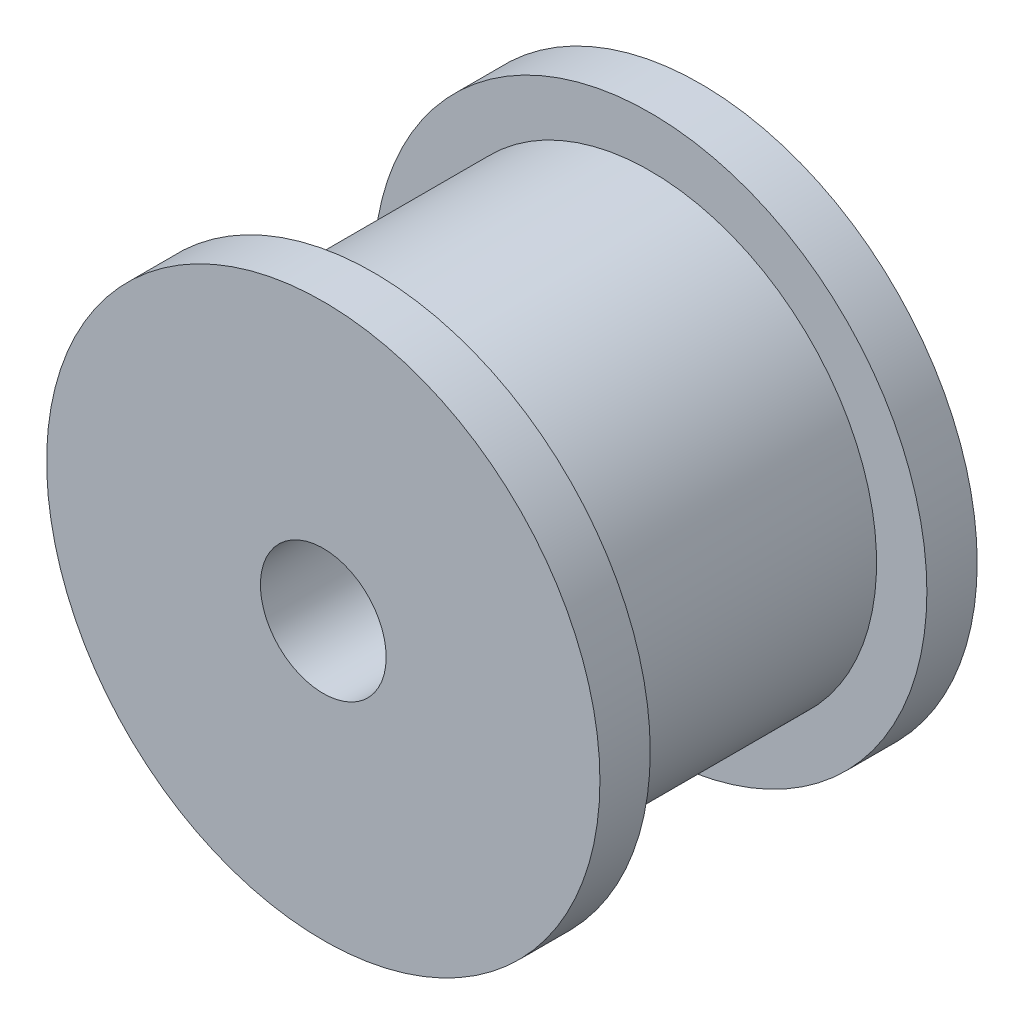
ISO-10303-21;
HEADER;
FILE_DESCRIPTION(('STEP AP214'),'2;1');
FILE_NAME('part.step','',(''),(''),'','','');
FILE_SCHEMA(('AUTOMOTIVE_DESIGN { 1 0 10303 214 1 1 1 1 }'));
ENDSEC;
DATA;
#1=APPLICATION_CONTEXT('core data for automotive mechanical design processes');
#2=APPLICATION_PROTOCOL_DEFINITION('international standard','automotive_design',2000,#1);
#3=PRODUCT_CONTEXT('',#1,'mechanical');
#4=PRODUCT('Part','Part','',(#3));
#5=PRODUCT_RELATED_PRODUCT_CATEGORY('part','',(#4));
#6=PRODUCT_DEFINITION_FORMATION('','',#4);
#7=PRODUCT_DEFINITION_CONTEXT('part definition',#1,'design');
#8=PRODUCT_DEFINITION('design','',#6,#7);
#9=PRODUCT_DEFINITION_SHAPE('','',#8);
#10=(LENGTH_UNIT() NAMED_UNIT(*) SI_UNIT(.MILLI.,.METRE.));
#11=(NAMED_UNIT(*) PLANE_ANGLE_UNIT() SI_UNIT($,.RADIAN.));
#12=(NAMED_UNIT(*) SI_UNIT($,.STERADIAN.) SOLID_ANGLE_UNIT());
#13=UNCERTAINTY_MEASURE_WITH_UNIT(LENGTH_MEASURE(1.E-05),#10,'distance_accuracy_value','');
#14=(GEOMETRIC_REPRESENTATION_CONTEXT(3) GLOBAL_UNCERTAINTY_ASSIGNED_CONTEXT((#13)) GLOBAL_UNIT_ASSIGNED_CONTEXT((#10,
#11,#12)) REPRESENTATION_CONTEXT('',''));
#15=CARTESIAN_POINT('',(0.,0.,0.));
#16=DIRECTION('',(0.,0.,1.));
#17=DIRECTION('',(1.,0.,0.));
#18=AXIS2_PLACEMENT_3D('',#15,#16,#17);
#19=CARTESIAN_POINT('',(0.,0.,15.));
#20=DIRECTION('',(0.,0.,-1.));
#21=DIRECTION('',(-1.,0.,0.));
#22=AXIS2_PLACEMENT_3D('',#19,#20,#21);
#23=CYLINDRICAL_SURFACE('',#22,9.);
#24=CARTESIAN_POINT('',(0.,0.,13.));
#25=DIRECTION('',(0.,0.,1.));
#26=DIRECTION('',(1.,0.,0.));
#27=AXIS2_PLACEMENT_3D('',#24,#25,#26);
#28=CIRCLE('',#27,9.);
#29=CARTESIAN_POINT('',(9.,0.,13.));
#30=VERTEX_POINT('',#29);
#31=EDGE_CURVE('E47',#30,#30,#28,.T.);
#32=ORIENTED_EDGE('',*,*,#31,.F.);
#33=EDGE_LOOP('',(#32));
#34=FACE_BOUND('',#33,.T.);
#35=CARTESIAN_POINT('',(0.,0.,2.));
#36=DIRECTION('',(0.,0.,-1.));
#37=DIRECTION('',(-1.,0.,0.));
#38=AXIS2_PLACEMENT_3D('',#35,#36,#37);
#39=CIRCLE('',#38,9.);
#40=CARTESIAN_POINT('',(-9.,0.,2.));
#41=VERTEX_POINT('',#40);
#42=EDGE_CURVE('E10',#41,#41,#39,.T.);
#43=ORIENTED_EDGE('',*,*,#42,.F.);
#44=EDGE_LOOP('',(#43));
#45=FACE_BOUND('',#44,.T.);
#46=ADVANCED_FACE('F41',(#34,#45),#23,.T.);
#47=CARTESIAN_POINT('',(0.,0.,13.));
#48=DIRECTION('',(0.,0.,1.));
#49=DIRECTION('',(1.,0.,0.));
#50=AXIS2_PLACEMENT_3D('',#47,#48,#49);
#51=CYLINDRICAL_SURFACE('',#50,11.);
#52=CARTESIAN_POINT('',(0.,0.,13.));
#53=DIRECTION('',(0.,0.,1.));
#54=DIRECTION('',(1.,0.,0.));
#55=AXIS2_PLACEMENT_3D('',#52,#53,#54);
#56=CIRCLE('',#55,11.);
#57=CARTESIAN_POINT('',(11.,0.,13.));
#58=VERTEX_POINT('',#57);
#59=EDGE_CURVE('E51',#58,#58,#56,.T.);
#60=ORIENTED_EDGE('',*,*,#59,.T.);
#61=EDGE_LOOP('',(#60));
#62=FACE_BOUND('',#61,.T.);
#63=CARTESIAN_POINT('',(0.,0.,15.));
#64=DIRECTION('',(0.,0.,1.));
#65=DIRECTION('',(1.,0.,0.));
#66=AXIS2_PLACEMENT_3D('',#63,#64,#65);
#67=CIRCLE('',#66,11.);
#68=CARTESIAN_POINT('',(11.,0.,15.));
#69=VERTEX_POINT('',#68);
#70=EDGE_CURVE('E55',#69,#69,#67,.T.);
#71=ORIENTED_EDGE('',*,*,#70,.F.);
#72=EDGE_LOOP('',(#71));
#73=FACE_BOUND('',#72,.T.);
#74=ADVANCED_FACE('F90',(#62,#73),#51,.T.);
#75=CARTESIAN_POINT('',(0.,0.,13.));
#76=DIRECTION('',(0.,0.,1.));
#77=DIRECTION('',(1.,0.,0.));
#78=AXIS2_PLACEMENT_3D('',#75,#76,#77);
#79=PLANE('',#78);
#80=ORIENTED_EDGE('',*,*,#31,.T.);
#81=EDGE_LOOP('',(#80));
#82=FACE_BOUND('',#81,.T.);
#83=ORIENTED_EDGE('',*,*,#59,.F.);
#84=EDGE_LOOP('',(#83));
#85=FACE_BOUND('',#84,.T.);
#86=ADVANCED_FACE('F86',(#82,#85),#79,.F.);
#87=CARTESIAN_POINT('',(0.,0.,15.));
#88=DIRECTION('',(0.,0.,1.));
#89=DIRECTION('',(1.,0.,0.));
#90=AXIS2_PLACEMENT_3D('',#87,#88,#89);
#91=PLANE('',#90);
#92=CARTESIAN_POINT('',(0.,0.,15.));
#93=DIRECTION('',(0.,0.,1.));
#94=DIRECTION('',(1.,0.,0.));
#95=AXIS2_PLACEMENT_3D('',#92,#93,#94);
#96=CIRCLE('',#95,2.5);
#97=CARTESIAN_POINT('',(2.5,0.,15.));
#98=VERTEX_POINT('',#97);
#99=EDGE_CURVE('E67',#98,#98,#96,.T.);
#100=ORIENTED_EDGE('',*,*,#99,.F.);
#101=EDGE_LOOP('',(#100));
#102=FACE_BOUND('',#101,.T.);
#103=ORIENTED_EDGE('',*,*,#70,.T.);
#104=EDGE_LOOP('',(#103));
#105=FACE_BOUND('',#104,.T.);
#106=ADVANCED_FACE('F82',(#102,#105),#91,.T.);
#107=CARTESIAN_POINT('',(0.,0.,2.));
#108=DIRECTION('',(0.,0.,-1.));
#109=DIRECTION('',(-1.,0.,0.));
#110=AXIS2_PLACEMENT_3D('',#107,#108,#109);
#111=CYLINDRICAL_SURFACE('',#110,11.);
#112=CARTESIAN_POINT('',(0.,0.,2.));
#113=DIRECTION('',(0.,0.,1.));
#114=DIRECTION('',(1.,0.,0.));
#115=AXIS2_PLACEMENT_3D('',#112,#113,#114);
#116=CIRCLE('',#115,11.);
#117=CARTESIAN_POINT('',(11.,0.,2.));
#118=VERTEX_POINT('',#117);
#119=EDGE_CURVE('E59',#118,#118,#116,.T.);
#120=ORIENTED_EDGE('',*,*,#119,.F.);
#121=EDGE_LOOP('',(#120));
#122=FACE_BOUND('',#121,.T.);
#123=CARTESIAN_POINT('',(0.,0.,0.));
#124=DIRECTION('',(0.,0.,1.));
#125=DIRECTION('',(1.,0.,0.));
#126=AXIS2_PLACEMENT_3D('',#123,#124,#125);
#127=CIRCLE('',#126,11.);
#128=CARTESIAN_POINT('',(11.,0.,0.));
#129=VERTEX_POINT('',#128);
#130=EDGE_CURVE('E61',#129,#129,#127,.T.);
#131=ORIENTED_EDGE('',*,*,#130,.T.);
#132=EDGE_LOOP('',(#131));
#133=FACE_BOUND('',#132,.T.);
#134=ADVANCED_FACE('F85',(#122,#133),#111,.T.);
#135=CARTESIAN_POINT('',(0.,0.,2.));
#136=DIRECTION('',(0.,0.,-1.));
#137=DIRECTION('',(1.,0.,0.));
#138=AXIS2_PLACEMENT_3D('',#135,#136,#137);
#139=PLANE('',#138);
#140=ORIENTED_EDGE('',*,*,#42,.T.);
#141=EDGE_LOOP('',(#140));
#142=FACE_BOUND('',#141,.T.);
#143=ORIENTED_EDGE('',*,*,#119,.T.);
#144=EDGE_LOOP('',(#143));
#145=FACE_BOUND('',#144,.T.);
#146=ADVANCED_FACE('F102',(#142,#145),#139,.F.);
#147=CARTESIAN_POINT('',(0.,0.,0.));
#148=DIRECTION('',(0.,0.,1.));
#149=DIRECTION('',(1.,0.,0.));
#150=AXIS2_PLACEMENT_3D('',#147,#148,#149);
#151=PLANE('',#150);
#152=CARTESIAN_POINT('',(0.,0.,0.));
#153=DIRECTION('',(0.,0.,1.));
#154=DIRECTION('',(1.,0.,0.));
#155=AXIS2_PLACEMENT_3D('',#152,#153,#154);
#156=CIRCLE('',#155,2.5);
#157=CARTESIAN_POINT('',(2.5,0.,0.));
#158=VERTEX_POINT('',#157);
#159=EDGE_CURVE('E64',#158,#158,#156,.T.);
#160=ORIENTED_EDGE('',*,*,#159,.T.);
#161=EDGE_LOOP('',(#160));
#162=FACE_BOUND('',#161,.T.);
#163=ORIENTED_EDGE('',*,*,#130,.F.);
#164=EDGE_LOOP('',(#163));
#165=FACE_BOUND('',#164,.T.);
#166=ADVANCED_FACE('F73',(#162,#165),#151,.F.);
#167=CARTESIAN_POINT('',(0.,0.,0.));
#168=DIRECTION('',(0.,0.,1.));
#169=DIRECTION('',(1.,0.,0.));
#170=AXIS2_PLACEMENT_3D('',#167,#168,#169);
#171=CYLINDRICAL_SURFACE('',#170,2.5);
#172=ORIENTED_EDGE('',*,*,#159,.F.);
#173=EDGE_LOOP('',(#172));
#174=FACE_BOUND('',#173,.T.);
#175=ORIENTED_EDGE('',*,*,#99,.T.);
#176=EDGE_LOOP('',(#175));
#177=FACE_BOUND('',#176,.T.);
#178=ADVANCED_FACE('F76',(#174,#177),#171,.F.);
#179=CLOSED_SHELL('',(#46,#74,#86,#106,#134,#146,#166,#178));
#180=MANIFOLD_SOLID_BREP('B2',#179);
#181=ADVANCED_BREP_SHAPE_REPRESENTATION('',(#18,#180),#14);
#182=SHAPE_DEFINITION_REPRESENTATION(#9,#181);
ENDSEC;
END-ISO-10303-21;
